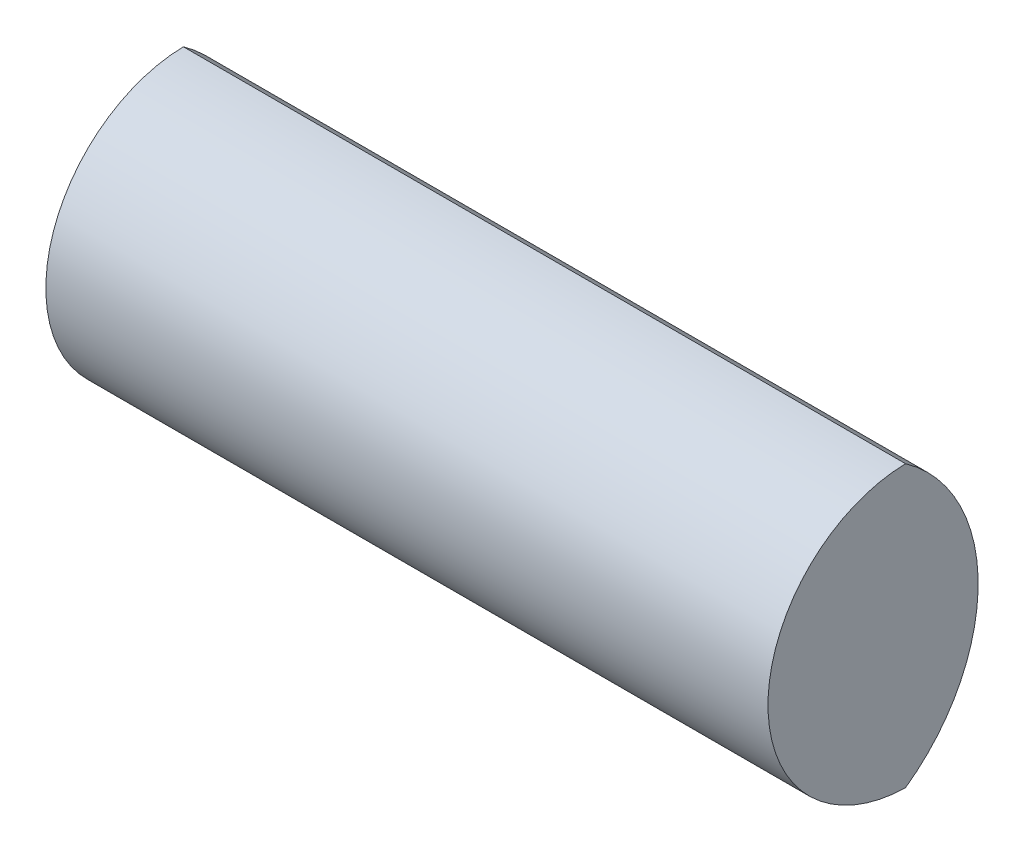
ISO-10303-21;
HEADER;
FILE_DESCRIPTION(('STEP AP214'),'2;1');
FILE_NAME('part.step','',(''),(''),'','','');
FILE_SCHEMA(('AUTOMOTIVE_DESIGN { 1 0 10303 214 1 1 1 1 }'));
ENDSEC;
DATA;
#1=APPLICATION_CONTEXT('core data for automotive mechanical design processes');
#2=APPLICATION_PROTOCOL_DEFINITION('international standard','automotive_design',2000,#1);
#3=PRODUCT_CONTEXT('',#1,'mechanical');
#4=PRODUCT('Part','Part','',(#3));
#5=PRODUCT_RELATED_PRODUCT_CATEGORY('part','',(#4));
#6=PRODUCT_DEFINITION_FORMATION('','',#4);
#7=PRODUCT_DEFINITION_CONTEXT('part definition',#1,'design');
#8=PRODUCT_DEFINITION('design','',#6,#7);
#9=PRODUCT_DEFINITION_SHAPE('','',#8);
#10=(LENGTH_UNIT() NAMED_UNIT(*) SI_UNIT(.MILLI.,.METRE.));
#11=(NAMED_UNIT(*) PLANE_ANGLE_UNIT() SI_UNIT($,.RADIAN.));
#12=(NAMED_UNIT(*) SI_UNIT($,.STERADIAN.) SOLID_ANGLE_UNIT());
#13=UNCERTAINTY_MEASURE_WITH_UNIT(LENGTH_MEASURE(1.E-05),#10,'distance_accuracy_value','');
#14=(GEOMETRIC_REPRESENTATION_CONTEXT(3) GLOBAL_UNCERTAINTY_ASSIGNED_CONTEXT((#13)) GLOBAL_UNIT_ASSIGNED_CONTEXT((#10,
#11,#12)) REPRESENTATION_CONTEXT('',''));
#15=CARTESIAN_POINT('',(0.,0.,0.));
#16=DIRECTION('',(0.,0.,1.));
#17=DIRECTION('',(1.,0.,0.));
#18=AXIS2_PLACEMENT_3D('',#15,#16,#17);
#19=CARTESIAN_POINT('',(-62.334188953753,17.6914389944274,176.727148581343));
#20=DIRECTION('',(1.,0.,0.));
#21=DIRECTION('',(0.,0.,-1.));
#22=AXIS2_PLACEMENT_3D('',#19,#20,#21);
#23=CYLINDRICAL_SURFACE('',#22,2.61823468768156);
#24=CARTESIAN_POINT('',(-51.334188953753,17.6914389944274,176.727148581343));
#25=DIRECTION('',(-1.,0.,0.));
#26=DIRECTION('',(0.,0.,1.));
#27=AXIS2_PLACEMENT_3D('',#24,#25,#26);
#28=CIRCLE('',#27,2.61823468768156);
#29=CARTESIAN_POINT('',(-51.334188953753,19.8289772528206,175.215168729069));
#30=VERTEX_POINT('',#29);
#31=CARTESIAN_POINT('',(-51.334188953753,15.5539007360342,175.215168729069));
#32=VERTEX_POINT('',#31);
#33=EDGE_CURVE('E66',#30,#32,#28,.T.);
#34=ORIENTED_EDGE('',*,*,#33,.T.);
#35=DIRECTION('',(1.,0.,0.));
#36=VECTOR('',#35,1.);
#37=CARTESIAN_POINT('',(-62.334188953753,15.5539007360342,175.215168729069));
#38=LINE('',#37,#36);
#39=CARTESIAN_POINT('',(-62.334188953753,15.5539007360342,175.215168729069));
#40=VERTEX_POINT('',#39);
#41=EDGE_CURVE('E11',#40,#32,#38,.T.);
#42=ORIENTED_EDGE('',*,*,#41,.F.);
#43=CARTESIAN_POINT('',(-62.334188953753,17.6914389944274,176.727148581343));
#44=DIRECTION('',(-1.,0.,0.));
#45=DIRECTION('',(0.,0.,1.));
#46=AXIS2_PLACEMENT_3D('',#43,#44,#45);
#47=CIRCLE('',#46,2.61823468768156);
#48=CARTESIAN_POINT('',(-62.334188953753,19.8289772528206,175.215168729069));
#49=VERTEX_POINT('',#48);
#50=EDGE_CURVE('E65',#49,#40,#47,.T.);
#51=ORIENTED_EDGE('',*,*,#50,.F.);
#52=DIRECTION('',(1.,0.,0.));
#53=VECTOR('',#52,1.);
#54=CARTESIAN_POINT('',(-62.334188953753,19.8289772528206,175.215168729069));
#55=LINE('',#54,#53);
#56=EDGE_CURVE('E43',#49,#30,#55,.T.);
#57=ORIENTED_EDGE('',*,*,#56,.T.);
#58=EDGE_LOOP('',(#34,#42,#51,#57));
#59=FACE_BOUND('',#58,.T.);
#60=ADVANCED_FACE('F35',(#59),#23,.T.);
#61=CARTESIAN_POINT('',(-62.334188953753,17.6914389944274,175.172068608249));
#62=DIRECTION('',(1.,0.,0.));
#63=DIRECTION('',(0.,0.,-1.));
#64=AXIS2_PLACEMENT_3D('',#61,#62,#63);
#65=CYLINDRICAL_SURFACE('',#64,2.13797273755053);
#66=CARTESIAN_POINT('',(-51.334188953753,17.6914389944274,175.172068608249));
#67=DIRECTION('',(-1.,0.,0.));
#68=DIRECTION('',(0.,0.,1.));
#69=AXIS2_PLACEMENT_3D('',#66,#67,#68);
#70=CIRCLE('',#69,2.13797273755053);
#71=EDGE_CURVE('E58',#32,#30,#70,.T.);
#72=ORIENTED_EDGE('',*,*,#71,.T.);
#73=ORIENTED_EDGE('',*,*,#56,.F.);
#74=CARTESIAN_POINT('',(-62.334188953753,17.6914389944274,175.172068608249));
#75=DIRECTION('',(-1.,0.,0.));
#76=DIRECTION('',(0.,0.,1.));
#77=AXIS2_PLACEMENT_3D('',#74,#75,#76);
#78=CIRCLE('',#77,2.13797273755053);
#79=EDGE_CURVE('E50',#40,#49,#78,.T.);
#80=ORIENTED_EDGE('',*,*,#79,.F.);
#81=ORIENTED_EDGE('',*,*,#41,.T.);
#82=EDGE_LOOP('',(#72,#73,#80,#81));
#83=FACE_BOUND('',#82,.T.);
#84=ADVANCED_FACE('F61',(#83),#65,.T.);
#85=CARTESIAN_POINT('',(-62.334188953753,17.6914389944274,175.949608594796));
#86=DIRECTION('',(-1.,0.,0.));
#87=DIRECTION('',(0.,0.,1.));
#88=AXIS2_PLACEMENT_3D('',#85,#86,#87);
#89=PLANE('',#88);
#90=ORIENTED_EDGE('',*,*,#50,.T.);
#91=ORIENTED_EDGE('',*,*,#79,.T.);
#92=EDGE_LOOP('',(#90,#91));
#93=FACE_BOUND('',#92,.T.);
#94=ADVANCED_FACE('F73',(#93),#89,.T.);
#95=CARTESIAN_POINT('',(-51.334188953753,17.6914389944274,175.949608594796));
#96=DIRECTION('',(-1.,0.,0.));
#97=DIRECTION('',(0.,0.,1.));
#98=AXIS2_PLACEMENT_3D('',#95,#96,#97);
#99=PLANE('',#98);
#100=ORIENTED_EDGE('',*,*,#33,.F.);
#101=ORIENTED_EDGE('',*,*,#71,.F.);
#102=EDGE_LOOP('',(#100,#101));
#103=FACE_BOUND('',#102,.T.);
#104=ADVANCED_FACE('F69',(#103),#99,.F.);
#105=CLOSED_SHELL('',(#60,#84,#94,#104));
#106=MANIFOLD_SOLID_BREP('B2',#105);
#107=ADVANCED_BREP_SHAPE_REPRESENTATION('',(#18,#106),#14);
#108=SHAPE_DEFINITION_REPRESENTATION(#9,#107);
ENDSEC;
END-ISO-10303-21;
